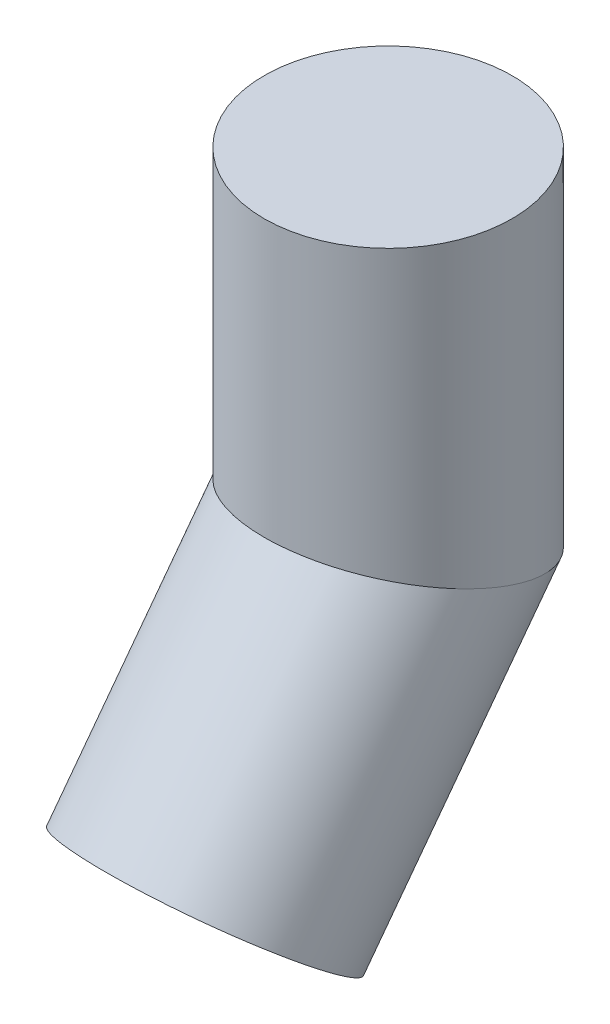
ISO-10303-21;
HEADER;
FILE_DESCRIPTION(('STEP AP214'),'2;1');
FILE_NAME('part.step','',(''),(''),'','','');
FILE_SCHEMA(('AUTOMOTIVE_DESIGN { 1 0 10303 214 1 1 1 1 }'));
ENDSEC;
DATA;
#1=APPLICATION_CONTEXT('core data for automotive mechanical design processes');
#2=APPLICATION_PROTOCOL_DEFINITION('international standard','automotive_design',2000,#1);
#3=PRODUCT_CONTEXT('',#1,'mechanical');
#4=PRODUCT('Part','Part','',(#3));
#5=PRODUCT_RELATED_PRODUCT_CATEGORY('part','',(#4));
#6=PRODUCT_DEFINITION_FORMATION('','',#4);
#7=PRODUCT_DEFINITION_CONTEXT('part definition',#1,'design');
#8=PRODUCT_DEFINITION('design','',#6,#7);
#9=PRODUCT_DEFINITION_SHAPE('','',#8);
#10=(LENGTH_UNIT() NAMED_UNIT(*) SI_UNIT(.MILLI.,.METRE.));
#11=(NAMED_UNIT(*) PLANE_ANGLE_UNIT() SI_UNIT($,.RADIAN.));
#12=(NAMED_UNIT(*) SI_UNIT($,.STERADIAN.) SOLID_ANGLE_UNIT());
#13=UNCERTAINTY_MEASURE_WITH_UNIT(LENGTH_MEASURE(1.E-05),#10,'distance_accuracy_value','');
#14=(GEOMETRIC_REPRESENTATION_CONTEXT(3) GLOBAL_UNCERTAINTY_ASSIGNED_CONTEXT((#13)) GLOBAL_UNIT_ASSIGNED_CONTEXT((#10,
#11,#12)) REPRESENTATION_CONTEXT('',''));
#15=CARTESIAN_POINT('',(0.,0.,0.));
#16=DIRECTION('',(0.,0.,1.));
#17=DIRECTION('',(1.,0.,0.));
#18=AXIS2_PLACEMENT_3D('',#15,#16,#17);
#19=CARTESIAN_POINT('',(0.,-10.,0.));
#20=DIRECTION('',(0.,1.,0.));
#21=DIRECTION('',(0.,0.,1.));
#22=AXIS2_PLACEMENT_3D('',#19,#20,#21);
#23=CYLINDRICAL_SURFACE('',#22,101.6);
#24=CARTESIAN_POINT('',(0.,0.,0.));
#25=DIRECTION('',(0.,1.,0.));
#26=DIRECTION('',(0.,0.,1.));
#27=AXIS2_PLACEMENT_3D('',#24,#25,#26);
#28=CIRCLE('',#27,101.6);
#29=CARTESIAN_POINT('',(0.,0.,101.6));
#30=VERTEX_POINT('',#29);
#31=EDGE_CURVE('E11',#30,#30,#28,.T.);
#32=ORIENTED_EDGE('',*,*,#31,.F.);
#33=EDGE_LOOP('',(#32));
#34=FACE_BOUND('',#33,.T.);
#35=CARTESIAN_POINT('',(0.,-260.,0.));
#36=DIRECTION('',(0.,-0.948683298050514,0.316227766016838));
#37=DIRECTION('',(0.,-0.316227766016838,-0.948683298050514));
#38=AXIS2_PLACEMENT_3D('',#35,#36,#37);
#39=ELLIPSE('',#38,107.095803424369,101.6);
#40=CARTESIAN_POINT('',(0.,-293.866666666667,-101.6));
#41=VERTEX_POINT('',#40);
#42=EDGE_CURVE('E44',#41,#41,#39,.F.);
#43=ORIENTED_EDGE('',*,*,#42,.T.);
#44=EDGE_LOOP('',(#43));
#45=FACE_BOUND('',#44,.T.);
#46=ADVANCED_FACE('F37',(#34,#45),#23,.T.);
#47=CARTESIAN_POINT('',(0.,0.,0.));
#48=DIRECTION('',(0.,1.,0.));
#49=DIRECTION('',(0.,0.,1.));
#50=AXIS2_PLACEMENT_3D('',#47,#48,#49);
#51=PLANE('',#50);
#52=ORIENTED_EDGE('',*,*,#31,.T.);
#53=EDGE_LOOP('',(#52));
#54=FACE_BOUND('',#53,.T.);
#55=ADVANCED_FACE('F58',(#54),#51,.T.);
#56=CARTESIAN_POINT('',(0.,-460.,150.));
#57=DIRECTION('',(0.,-0.8,0.6));
#58=DIRECTION('',(0.,-0.6,-0.8));
#59=AXIS2_PLACEMENT_3D('',#56,#57,#58);
#60=PLANE('',#59);
#61=CARTESIAN_POINT('',(0.,-460.,150.));
#62=DIRECTION('',(0.,-0.8,0.6));
#63=DIRECTION('',(0.,-0.6,-0.8));
#64=AXIS2_PLACEMENT_3D('',#61,#62,#63);
#65=CIRCLE('',#64,101.6);
#66=CARTESIAN_POINT('',(0.,-520.96,68.72));
#67=VERTEX_POINT('',#66);
#68=EDGE_CURVE('E49',#67,#67,#65,.T.);
#69=ORIENTED_EDGE('',*,*,#68,.T.);
#70=EDGE_LOOP('',(#69));
#71=FACE_BOUND('',#70,.T.);
#72=ADVANCED_FACE('F63',(#71),#60,.T.);
#73=CARTESIAN_POINT('',(0.,-230.117333333333,-22.412));
#74=DIRECTION('',(0.,-0.8,0.6));
#75=DIRECTION('',(0.,-0.6,-0.8));
#76=AXIS2_PLACEMENT_3D('',#73,#74,#75);
#77=CYLINDRICAL_SURFACE('',#76,101.6);
#78=ORIENTED_EDGE('',*,*,#42,.F.);
#79=EDGE_LOOP('',(#78));
#80=FACE_BOUND('',#79,.T.);
#81=ORIENTED_EDGE('',*,*,#68,.F.);
#82=EDGE_LOOP('',(#81));
#83=FACE_BOUND('',#82,.T.);
#84=ADVANCED_FACE('F53',(#80,#83),#77,.T.);
#85=CLOSED_SHELL('',(#46,#55,#72,#84));
#86=MANIFOLD_SOLID_BREP('B2',#85);
#87=ADVANCED_BREP_SHAPE_REPRESENTATION('',(#18,#86),#14);
#88=SHAPE_DEFINITION_REPRESENTATION(#9,#87);
ENDSEC;
END-ISO-10303-21;
